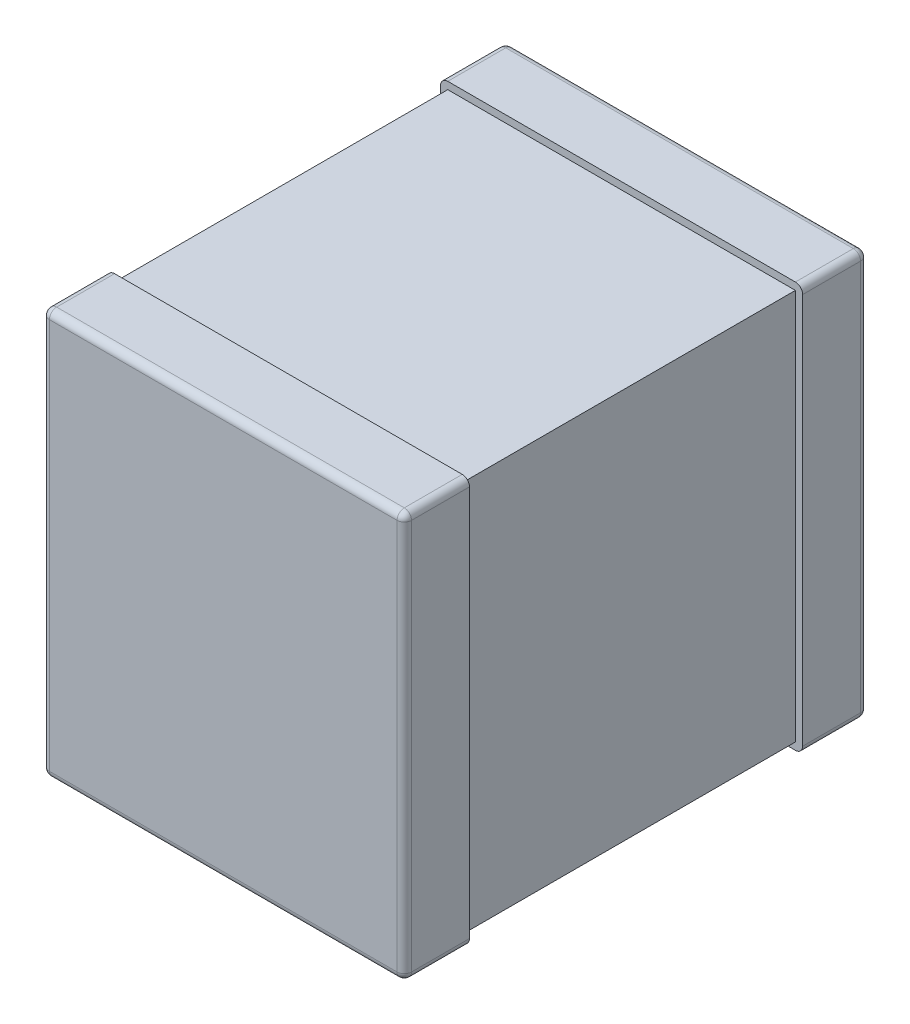
ISO-10303-21;
HEADER;
FILE_DESCRIPTION(('STEP AP214'),'2;1');
FILE_NAME('part.step','',(''),(''),'','','');
FILE_SCHEMA(('AUTOMOTIVE_DESIGN { 1 0 10303 214 1 1 1 1 }'));
ENDSEC;
DATA;
#1=APPLICATION_CONTEXT('core data for automotive mechanical design processes');
#2=APPLICATION_PROTOCOL_DEFINITION('international standard','automotive_design',2000,#1);
#3=PRODUCT_CONTEXT('',#1,'mechanical');
#4=PRODUCT('Part','Part','',(#3));
#5=PRODUCT_RELATED_PRODUCT_CATEGORY('part','',(#4));
#6=PRODUCT_DEFINITION_FORMATION('','',#4);
#7=PRODUCT_DEFINITION_CONTEXT('part definition',#1,'design');
#8=PRODUCT_DEFINITION('design','',#6,#7);
#9=PRODUCT_DEFINITION_SHAPE('','',#8);
#10=(LENGTH_UNIT() NAMED_UNIT(*) SI_UNIT(.MILLI.,.METRE.));
#11=(NAMED_UNIT(*) PLANE_ANGLE_UNIT() SI_UNIT($,.RADIAN.));
#12=(NAMED_UNIT(*) SI_UNIT($,.STERADIAN.) SOLID_ANGLE_UNIT());
#13=UNCERTAINTY_MEASURE_WITH_UNIT(LENGTH_MEASURE(1.E-05),#10,'distance_accuracy_value','');
#14=(GEOMETRIC_REPRESENTATION_CONTEXT(3) GLOBAL_UNCERTAINTY_ASSIGNED_CONTEXT((#13)) GLOBAL_UNIT_ASSIGNED_CONTEXT((#10,
#11,#12)) REPRESENTATION_CONTEXT('',''));
#15=CARTESIAN_POINT('',(0.,0.,0.));
#16=DIRECTION('',(0.,0.,1.));
#17=DIRECTION('',(1.,0.,0.));
#18=AXIS2_PLACEMENT_3D('',#15,#16,#17);
#19=CARTESIAN_POINT('',(-1.25,2.8,-1.6));
#20=DIRECTION('',(0.,0.,1.));
#21=DIRECTION('',(1.,0.,0.));
#22=AXIS2_PLACEMENT_3D('',#19,#20,#21);
#23=PLANE('',#22);
#24=DIRECTION('',(0.,-1.,0.));
#25=VECTOR('',#24,1.);
#26=CARTESIAN_POINT('',(1.2,2.8,-1.6));
#27=LINE('',#26,#25);
#28=CARTESIAN_POINT('',(1.2,0.0500000000000001,-1.6));
#29=VERTEX_POINT('',#28);
#30=CARTESIAN_POINT('',(1.2,2.75,-1.6));
#31=VERTEX_POINT('',#30);
#32=EDGE_CURVE('E306',#29,#31,#27,.F.);
#33=ORIENTED_EDGE('',*,*,#32,.F.);
#34=DIRECTION('',(-1.,0.,0.));
#35=VECTOR('',#34,1.);
#36=CARTESIAN_POINT('',(-1.25,0.0500000000000001,-1.6));
#37=LINE('',#36,#35);
#38=CARTESIAN_POINT('',(-1.2,0.0500000000000001,-1.6));
#39=VERTEX_POINT('',#38);
#40=EDGE_CURVE('E218',#39,#29,#37,.F.);
#41=ORIENTED_EDGE('',*,*,#40,.F.);
#42=DIRECTION('',(0.,-1.,0.));
#43=VECTOR('',#42,1.);
#44=CARTESIAN_POINT('',(-1.2,2.8,-1.6));
#45=LINE('',#44,#43);
#46=CARTESIAN_POINT('',(-1.2,2.75,-1.6));
#47=VERTEX_POINT('',#46);
#48=EDGE_CURVE('E315',#47,#39,#45,.T.);
#49=ORIENTED_EDGE('',*,*,#48,.F.);
#50=DIRECTION('',(1.,0.,0.));
#51=VECTOR('',#50,1.);
#52=CARTESIAN_POINT('',(-1.25,2.75,-1.6));
#53=LINE('',#52,#51);
#54=EDGE_CURVE('E266',#31,#47,#53,.F.);
#55=ORIENTED_EDGE('',*,*,#54,.F.);
#56=EDGE_LOOP('',(#33,#41,#49,#55));
#57=FACE_BOUND('',#56,.T.);
#58=ADVANCED_FACE('F16',(#57),#23,.F.);
#59=CARTESIAN_POINT('',(-1.2,0.05,-1.55));
#60=DIRECTION('',(1.,0.,0.));
#61=DIRECTION('',(0.,0.,-1.));
#62=AXIS2_PLACEMENT_3D('',#59,#60,#61);
#63=SPHERICAL_SURFACE('',#62,0.05);
#64=CARTESIAN_POINT('',(-1.2,0.0500000000000001,-1.55));
#65=DIRECTION('',(0.,-1.,0.));
#66=DIRECTION('',(0.,0.,-1.));
#67=AXIS2_PLACEMENT_3D('',#64,#65,#66);
#68=CIRCLE('',#67,0.0499999999999999);
#69=CARTESIAN_POINT('',(-1.25,0.0500000000000001,-1.55));
#70=VERTEX_POINT('',#69);
#71=EDGE_CURVE('E317',#39,#70,#68,.F.);
#72=ORIENTED_EDGE('',*,*,#71,.F.);
#73=CARTESIAN_POINT('',(-1.2,0.0500000000000001,-1.55));
#74=DIRECTION('',(-1.,0.,0.));
#75=DIRECTION('',(0.,0.,1.));
#76=AXIS2_PLACEMENT_3D('',#73,#74,#75);
#77=CIRCLE('',#76,0.0499999999999999);
#78=CARTESIAN_POINT('',(-1.2,0.,-1.55));
#79=VERTEX_POINT('',#78);
#80=EDGE_CURVE('E224',#79,#39,#77,.F.);
#81=ORIENTED_EDGE('',*,*,#80,.F.);
#82=CARTESIAN_POINT('',(-1.2,0.0500000000000001,-1.55));
#83=DIRECTION('',(0.,0.,1.));
#84=DIRECTION('',(1.,0.,0.));
#85=AXIS2_PLACEMENT_3D('',#82,#83,#84);
#86=CIRCLE('',#85,0.0499999999999999);
#87=EDGE_CURVE('E188',#70,#79,#86,.T.);
#88=ORIENTED_EDGE('',*,*,#87,.F.);
#89=EDGE_LOOP('',(#72,#81,#88));
#90=FACE_BOUND('',#89,.T.);
#91=ADVANCED_FACE('F292',(#90),#63,.T.);
#92=CARTESIAN_POINT('',(-1.2,2.8,-1.55));
#93=DIRECTION('',(0.,-1.,0.));
#94=DIRECTION('',(0.,0.,-1.));
#95=AXIS2_PLACEMENT_3D('',#92,#93,#94);
#96=CYLINDRICAL_SURFACE('',#95,0.0499999999999999);
#97=CARTESIAN_POINT('',(-1.2,2.75,-1.55));
#98=DIRECTION('',(0.,1.,0.));
#99=DIRECTION('',(1.,0.,0.));
#100=AXIS2_PLACEMENT_3D('',#97,#98,#99);
#101=CIRCLE('',#100,0.05);
#102=CARTESIAN_POINT('',(-1.25,2.75,-1.55));
#103=VERTEX_POINT('',#102);
#104=EDGE_CURVE('E277',#47,#103,#101,.T.);
#105=ORIENTED_EDGE('',*,*,#104,.F.);
#106=ORIENTED_EDGE('',*,*,#48,.T.);
#107=ORIENTED_EDGE('',*,*,#71,.T.);
#108=DIRECTION('',(0.,1.,0.));
#109=VECTOR('',#108,1.);
#110=CARTESIAN_POINT('',(-1.25,2.8,-1.55));
#111=LINE('',#110,#109);
#112=EDGE_CURVE('E186',#70,#103,#111,.T.);
#113=ORIENTED_EDGE('',*,*,#112,.T.);
#114=EDGE_LOOP('',(#105,#106,#107,#113));
#115=FACE_BOUND('',#114,.T.);
#116=ADVANCED_FACE('F289',(#115),#96,.T.);
#117=CARTESIAN_POINT('',(-1.2,2.75,-1.55));
#118=DIRECTION('',(1.,0.,0.));
#119=DIRECTION('',(0.,0.,-1.));
#120=AXIS2_PLACEMENT_3D('',#117,#118,#119);
#121=SPHERICAL_SURFACE('',#120,0.05);
#122=CARTESIAN_POINT('',(-1.2,2.75,-1.55));
#123=DIRECTION('',(0.,0.,-1.));
#124=DIRECTION('',(-1.,0.,0.));
#125=AXIS2_PLACEMENT_3D('',#122,#123,#124);
#126=CIRCLE('',#125,0.0499999999999999);
#127=CARTESIAN_POINT('',(-1.2,2.8,-1.55));
#128=VERTEX_POINT('',#127);
#129=EDGE_CURVE('E269',#128,#103,#126,.F.);
#130=ORIENTED_EDGE('',*,*,#129,.F.);
#131=CARTESIAN_POINT('',(-1.2,2.75,-1.55));
#132=DIRECTION('',(1.,0.,0.));
#133=DIRECTION('',(0.,0.,-1.));
#134=AXIS2_PLACEMENT_3D('',#131,#132,#133);
#135=CIRCLE('',#134,0.0499999999999999);
#136=EDGE_CURVE('E275',#47,#128,#135,.T.);
#137=ORIENTED_EDGE('',*,*,#136,.F.);
#138=ORIENTED_EDGE('',*,*,#104,.T.);
#139=EDGE_LOOP('',(#130,#137,#138));
#140=FACE_BOUND('',#139,.T.);
#141=ADVANCED_FACE('F286',(#140),#121,.T.);
#142=CARTESIAN_POINT('',(-1.25,2.75,-1.55));
#143=DIRECTION('',(1.,0.,0.));
#144=DIRECTION('',(0.,0.,-1.));
#145=AXIS2_PLACEMENT_3D('',#142,#143,#144);
#146=CYLINDRICAL_SURFACE('',#145,0.0499999999999999);
#147=CARTESIAN_POINT('',(1.2,2.75,-1.55));
#148=DIRECTION('',(1.,0.,0.));
#149=DIRECTION('',(0.,0.,-1.));
#150=AXIS2_PLACEMENT_3D('',#147,#148,#149);
#151=CIRCLE('',#150,0.0499999999999999);
#152=CARTESIAN_POINT('',(1.2,2.8,-1.55));
#153=VERTEX_POINT('',#152);
#154=EDGE_CURVE('E263',#31,#153,#151,.T.);
#155=ORIENTED_EDGE('',*,*,#154,.F.);
#156=ORIENTED_EDGE('',*,*,#54,.T.);
#157=ORIENTED_EDGE('',*,*,#136,.T.);
#158=DIRECTION('',(1.,0.,0.));
#159=VECTOR('',#158,1.);
#160=CARTESIAN_POINT('',(-1.25,2.8,-1.55));
#161=LINE('',#160,#159);
#162=EDGE_CURVE('E369',#153,#128,#161,.F.);
#163=ORIENTED_EDGE('',*,*,#162,.F.);
#164=EDGE_LOOP('',(#155,#156,#157,#163));
#165=FACE_BOUND('',#164,.T.);
#166=ADVANCED_FACE('F255',(#165),#146,.T.);
#167=CARTESIAN_POINT('',(1.2,2.75,-1.55));
#168=DIRECTION('',(1.,0.,0.));
#169=DIRECTION('',(0.,0.,-1.));
#170=AXIS2_PLACEMENT_3D('',#167,#168,#169);
#171=SPHERICAL_SURFACE('',#170,0.05);
#172=CARTESIAN_POINT('',(1.2,2.75,-1.55));
#173=DIRECTION('',(0.,0.,1.));
#174=DIRECTION('',(1.,0.,0.));
#175=AXIS2_PLACEMENT_3D('',#172,#173,#174);
#176=CIRCLE('',#175,0.0499999999999999);
#177=CARTESIAN_POINT('',(1.25,2.75,-1.55));
#178=VERTEX_POINT('',#177);
#179=EDGE_CURVE('E364',#178,#153,#176,.T.);
#180=ORIENTED_EDGE('',*,*,#179,.F.);
#181=CARTESIAN_POINT('',(1.2,2.75,-1.55));
#182=DIRECTION('',(0.,-1.,0.));
#183=DIRECTION('',(0.,0.,-1.));
#184=AXIS2_PLACEMENT_3D('',#181,#182,#183);
#185=CIRCLE('',#184,0.0499999999999999);
#186=EDGE_CURVE('E265',#31,#178,#185,.T.);
#187=ORIENTED_EDGE('',*,*,#186,.F.);
#188=ORIENTED_EDGE('',*,*,#154,.T.);
#189=EDGE_LOOP('',(#180,#187,#188));
#190=FACE_BOUND('',#189,.T.);
#191=ADVANCED_FACE('F250',(#190),#171,.T.);
#192=CARTESIAN_POINT('',(1.2,2.8,-1.55));
#193=DIRECTION('',(0.,-1.,0.));
#194=DIRECTION('',(0.,0.,-1.));
#195=AXIS2_PLACEMENT_3D('',#192,#193,#194);
#196=CYLINDRICAL_SURFACE('',#195,0.0499999999999999);
#197=CARTESIAN_POINT('',(1.2,0.05,-1.55));
#198=DIRECTION('',(0.,1.,0.));
#199=DIRECTION('',(1.,0.,0.));
#200=AXIS2_PLACEMENT_3D('',#197,#198,#199);
#201=CIRCLE('',#200,0.05);
#202=CARTESIAN_POINT('',(1.25,0.0500000000000001,-1.55));
#203=VERTEX_POINT('',#202);
#204=EDGE_CURVE('E226',#29,#203,#201,.F.);
#205=ORIENTED_EDGE('',*,*,#204,.F.);
#206=ORIENTED_EDGE('',*,*,#32,.T.);
#207=ORIENTED_EDGE('',*,*,#186,.T.);
#208=DIRECTION('',(0.,1.,0.));
#209=VECTOR('',#208,1.);
#210=CARTESIAN_POINT('',(1.25,2.8,-1.55));
#211=LINE('',#210,#209);
#212=EDGE_CURVE('E229',#178,#203,#211,.F.);
#213=ORIENTED_EDGE('',*,*,#212,.T.);
#214=EDGE_LOOP('',(#205,#206,#207,#213));
#215=FACE_BOUND('',#214,.T.);
#216=ADVANCED_FACE('F245',(#215),#196,.T.);
#217=CARTESIAN_POINT('',(1.2,0.05,-1.55));
#218=DIRECTION('',(1.,0.,0.));
#219=DIRECTION('',(0.,0.,-1.));
#220=AXIS2_PLACEMENT_3D('',#217,#218,#219);
#221=SPHERICAL_SURFACE('',#220,0.05);
#222=CARTESIAN_POINT('',(1.2,0.0500000000000001,-1.55));
#223=DIRECTION('',(-1.,0.,0.));
#224=DIRECTION('',(0.,0.,1.));
#225=AXIS2_PLACEMENT_3D('',#222,#223,#224);
#226=CIRCLE('',#225,0.0499999999999999);
#227=CARTESIAN_POINT('',(1.2,0.,-1.55));
#228=VERTEX_POINT('',#227);
#229=EDGE_CURVE('E216',#29,#228,#226,.T.);
#230=ORIENTED_EDGE('',*,*,#229,.F.);
#231=ORIENTED_EDGE('',*,*,#204,.T.);
#232=CARTESIAN_POINT('',(1.2,0.0500000000000001,-1.55));
#233=DIRECTION('',(0.,0.,-1.));
#234=DIRECTION('',(-1.,0.,0.));
#235=AXIS2_PLACEMENT_3D('',#232,#233,#234);
#236=CIRCLE('',#235,0.0499999999999999);
#237=EDGE_CURVE('E232',#228,#203,#236,.F.);
#238=ORIENTED_EDGE('',*,*,#237,.F.);
#239=EDGE_LOOP('',(#230,#231,#238));
#240=FACE_BOUND('',#239,.T.);
#241=ADVANCED_FACE('F240',(#240),#221,.T.);
#242=CARTESIAN_POINT('',(-1.25,0.0500000000000001,-1.55));
#243=DIRECTION('',(-1.,0.,0.));
#244=DIRECTION('',(0.,0.,1.));
#245=AXIS2_PLACEMENT_3D('',#242,#243,#244);
#246=CYLINDRICAL_SURFACE('',#245,0.0499999999999999);
#247=ORIENTED_EDGE('',*,*,#229,.T.);
#248=DIRECTION('',(1.,0.,0.));
#249=VECTOR('',#248,1.);
#250=CARTESIAN_POINT('',(-1.25,0.,-1.55));
#251=LINE('',#250,#249);
#252=EDGE_CURVE('E201',#228,#79,#251,.F.);
#253=ORIENTED_EDGE('',*,*,#252,.T.);
#254=ORIENTED_EDGE('',*,*,#80,.T.);
#255=ORIENTED_EDGE('',*,*,#40,.T.);
#256=EDGE_LOOP('',(#247,#253,#254,#255));
#257=FACE_BOUND('',#256,.T.);
#258=ADVANCED_FACE('F244',(#257),#246,.T.);
#259=CARTESIAN_POINT('',(-1.2,0.0500000000000001,-1.6));
#260=DIRECTION('',(0.,0.,1.));
#261=DIRECTION('',(1.,0.,0.));
#262=AXIS2_PLACEMENT_3D('',#259,#260,#261);
#263=CYLINDRICAL_SURFACE('',#262,0.0499999999999999);
#264=ORIENTED_EDGE('',*,*,#87,.T.);
#265=DIRECTION('',(0.,0.,1.));
#266=VECTOR('',#265,1.);
#267=CARTESIAN_POINT('',(-1.2,0.,1.6));
#268=LINE('',#267,#266);
#269=CARTESIAN_POINT('',(-1.2,0.,-1.15));
#270=VERTEX_POINT('',#269);
#271=EDGE_CURVE('E199',#79,#270,#268,.T.);
#272=ORIENTED_EDGE('',*,*,#271,.T.);
#273=CARTESIAN_POINT('',(-1.2,0.0500000000000001,-1.15));
#274=DIRECTION('',(0.,0.,1.));
#275=DIRECTION('',(1.,0.,0.));
#276=AXIS2_PLACEMENT_3D('',#273,#274,#275);
#277=CIRCLE('',#276,0.0499999999999999);
#278=CARTESIAN_POINT('',(-1.25,0.0500000000000001,-1.15));
#279=VERTEX_POINT('',#278);
#280=EDGE_CURVE('E19',#270,#279,#277,.F.);
#281=ORIENTED_EDGE('',*,*,#280,.T.);
#282=DIRECTION('',(0.,0.,-1.));
#283=VECTOR('',#282,1.);
#284=CARTESIAN_POINT('',(-1.25,0.0500000000000001,-1.6));
#285=LINE('',#284,#283);
#286=EDGE_CURVE('E181',#279,#70,#285,.T.);
#287=ORIENTED_EDGE('',*,*,#286,.T.);
#288=EDGE_LOOP('',(#264,#272,#281,#287));
#289=FACE_BOUND('',#288,.T.);
#290=ADVANCED_FACE('F197',(#289),#263,.T.);
#291=CARTESIAN_POINT('',(-1.25,2.8,-1.6));
#292=DIRECTION('',(1.,0.,0.));
#293=DIRECTION('',(0.,0.,-1.));
#294=AXIS2_PLACEMENT_3D('',#291,#292,#293);
#295=PLANE('',#294);
#296=ORIENTED_EDGE('',*,*,#286,.F.);
#297=DIRECTION('',(0.,1.,0.));
#298=VECTOR('',#297,1.);
#299=CARTESIAN_POINT('',(-1.25,3.11952114007836,-1.15));
#300=LINE('',#299,#298);
#301=CARTESIAN_POINT('',(-1.25,2.75,-1.15));
#302=VERTEX_POINT('',#301);
#303=EDGE_CURVE('E184',#279,#302,#300,.T.);
#304=ORIENTED_EDGE('',*,*,#303,.T.);
#305=DIRECTION('',(0.,0.,-1.));
#306=VECTOR('',#305,1.);
#307=CARTESIAN_POINT('',(-1.25,2.75,1.6));
#308=LINE('',#307,#306);
#309=EDGE_CURVE('E272',#103,#302,#308,.F.);
#310=ORIENTED_EDGE('',*,*,#309,.F.);
#311=ORIENTED_EDGE('',*,*,#112,.F.);
#312=EDGE_LOOP('',(#296,#304,#310,#311));
#313=FACE_BOUND('',#312,.T.);
#314=ADVANCED_FACE('F182',(#313),#295,.F.);
#315=CARTESIAN_POINT('',(-1.2,2.75,1.6));
#316=DIRECTION('',(0.,0.,-1.));
#317=DIRECTION('',(-1.,0.,0.));
#318=AXIS2_PLACEMENT_3D('',#315,#316,#317);
#319=CYLINDRICAL_SURFACE('',#318,0.0499999999999999);
#320=ORIENTED_EDGE('',*,*,#129,.T.);
#321=ORIENTED_EDGE('',*,*,#309,.T.);
#322=CARTESIAN_POINT('',(-1.2,2.75,-1.15));
#323=DIRECTION('',(0.,0.,-1.));
#324=DIRECTION('',(-1.,0.,0.));
#325=AXIS2_PLACEMENT_3D('',#322,#323,#324);
#326=CIRCLE('',#325,0.0499999999999999);
#327=CARTESIAN_POINT('',(-1.2,2.8,-1.15));
#328=VERTEX_POINT('',#327);
#329=EDGE_CURVE('E195',#302,#328,#326,.T.);
#330=ORIENTED_EDGE('',*,*,#329,.T.);
#331=DIRECTION('',(0.,0.,1.));
#332=VECTOR('',#331,1.);
#333=CARTESIAN_POINT('',(-1.2,2.8,1.6));
#334=LINE('',#333,#332);
#335=EDGE_CURVE('E367',#128,#328,#334,.T.);
#336=ORIENTED_EDGE('',*,*,#335,.F.);
#337=EDGE_LOOP('',(#320,#321,#330,#336));
#338=FACE_BOUND('',#337,.T.);
#339=ADVANCED_FACE('F402',(#338),#319,.T.);
#340=CARTESIAN_POINT('',(-1.25,2.8,1.6));
#341=DIRECTION('',(0.,1.,0.));
#342=DIRECTION('',(0.,0.,1.));
#343=AXIS2_PLACEMENT_3D('',#340,#341,#342);
#344=PLANE('',#343);
#345=ORIENTED_EDGE('',*,*,#162,.T.);
#346=ORIENTED_EDGE('',*,*,#335,.T.);
#347=DIRECTION('',(-1.,0.,0.));
#348=VECTOR('',#347,1.);
#349=CARTESIAN_POINT('',(-1.25,2.8,-1.15));
#350=LINE('',#349,#348);
#351=CARTESIAN_POINT('',(1.2,2.8,-1.15));
#352=VERTEX_POINT('',#351);
#353=EDGE_CURVE('E339',#328,#352,#350,.F.);
#354=ORIENTED_EDGE('',*,*,#353,.T.);
#355=DIRECTION('',(0.,0.,1.));
#356=VECTOR('',#355,1.);
#357=CARTESIAN_POINT('',(1.2,2.8,1.6));
#358=LINE('',#357,#356);
#359=EDGE_CURVE('E360',#153,#352,#358,.T.);
#360=ORIENTED_EDGE('',*,*,#359,.F.);
#361=EDGE_LOOP('',(#345,#346,#354,#360));
#362=FACE_BOUND('',#361,.T.);
#363=ADVANCED_FACE('F396',(#362),#344,.T.);
#364=CARTESIAN_POINT('',(1.2,2.75,1.6));
#365=DIRECTION('',(0.,0.,1.));
#366=DIRECTION('',(1.,0.,0.));
#367=AXIS2_PLACEMENT_3D('',#364,#365,#366);
#368=CYLINDRICAL_SURFACE('',#367,0.0499999999999999);
#369=ORIENTED_EDGE('',*,*,#179,.T.);
#370=ORIENTED_EDGE('',*,*,#359,.T.);
#371=CARTESIAN_POINT('',(1.2,2.75,-1.15));
#372=DIRECTION('',(0.,0.,1.));
#373=DIRECTION('',(1.,0.,0.));
#374=AXIS2_PLACEMENT_3D('',#371,#372,#373);
#375=CIRCLE('',#374,0.0499999999999999);
#376=CARTESIAN_POINT('',(1.25,2.75,-1.15));
#377=VERTEX_POINT('',#376);
#378=EDGE_CURVE('E337',#352,#377,#375,.F.);
#379=ORIENTED_EDGE('',*,*,#378,.T.);
#380=DIRECTION('',(0.,0.,1.));
#381=VECTOR('',#380,1.);
#382=CARTESIAN_POINT('',(1.25,2.75,-1.6));
#383=LINE('',#382,#381);
#384=EDGE_CURVE('E233',#377,#178,#383,.F.);
#385=ORIENTED_EDGE('',*,*,#384,.T.);
#386=EDGE_LOOP('',(#369,#370,#379,#385));
#387=FACE_BOUND('',#386,.T.);
#388=ADVANCED_FACE('F393',(#387),#368,.T.);
#389=CARTESIAN_POINT('',(1.25,2.8,-1.6));
#390=DIRECTION('',(-1.,0.,0.));
#391=DIRECTION('',(0.,0.,1.));
#392=AXIS2_PLACEMENT_3D('',#389,#390,#391);
#393=PLANE('',#392);
#394=DIRECTION('',(0.,0.,-1.));
#395=VECTOR('',#394,1.);
#396=CARTESIAN_POINT('',(1.25,0.0500000000000001,-1.6));
#397=LINE('',#396,#395);
#398=CARTESIAN_POINT('',(1.25,0.0500000000000001,-1.15));
#399=VERTEX_POINT('',#398);
#400=EDGE_CURVE('E352',#203,#399,#397,.F.);
#401=ORIENTED_EDGE('',*,*,#400,.F.);
#402=ORIENTED_EDGE('',*,*,#212,.F.);
#403=ORIENTED_EDGE('',*,*,#384,.F.);
#404=DIRECTION('',(0.,1.,0.));
#405=VECTOR('',#404,1.);
#406=CARTESIAN_POINT('',(1.25,3.11952114007836,-1.15));
#407=LINE('',#406,#405);
#408=EDGE_CURVE('E336',#377,#399,#407,.F.);
#409=ORIENTED_EDGE('',*,*,#408,.T.);
#410=EDGE_LOOP('',(#401,#402,#403,#409));
#411=FACE_BOUND('',#410,.T.);
#412=ADVANCED_FACE('F388',(#411),#393,.F.);
#413=CARTESIAN_POINT('',(1.2,0.0500000000000001,-1.6));
#414=DIRECTION('',(0.,0.,-1.));
#415=DIRECTION('',(-1.,0.,0.));
#416=AXIS2_PLACEMENT_3D('',#413,#414,#415);
#417=CYLINDRICAL_SURFACE('',#416,0.0499999999999999);
#418=ORIENTED_EDGE('',*,*,#237,.T.);
#419=ORIENTED_EDGE('',*,*,#400,.T.);
#420=CARTESIAN_POINT('',(1.2,0.0500000000000001,-1.15));
#421=DIRECTION('',(0.,0.,-1.));
#422=DIRECTION('',(-1.,0.,0.));
#423=AXIS2_PLACEMENT_3D('',#420,#421,#422);
#424=CIRCLE('',#423,0.0499999999999999);
#425=CARTESIAN_POINT('',(1.2,0.,-1.15));
#426=VERTEX_POINT('',#425);
#427=EDGE_CURVE('E332',#399,#426,#424,.T.);
#428=ORIENTED_EDGE('',*,*,#427,.T.);
#429=DIRECTION('',(0.,0.,1.));
#430=VECTOR('',#429,1.);
#431=CARTESIAN_POINT('',(1.2,0.,1.6));
#432=LINE('',#431,#430);
#433=EDGE_CURVE('E203',#426,#228,#432,.F.);
#434=ORIENTED_EDGE('',*,*,#433,.T.);
#435=EDGE_LOOP('',(#418,#419,#428,#434));
#436=FACE_BOUND('',#435,.T.);
#437=ADVANCED_FACE('F379',(#436),#417,.T.);
#438=CARTESIAN_POINT('',(-1.25,0.,1.6));
#439=DIRECTION('',(0.,1.,0.));
#440=DIRECTION('',(0.,0.,1.));
#441=AXIS2_PLACEMENT_3D('',#438,#439,#440);
#442=PLANE('',#441);
#443=ORIENTED_EDGE('',*,*,#433,.F.);
#444=DIRECTION('',(-1.,0.,0.));
#445=VECTOR('',#444,1.);
#446=CARTESIAN_POINT('',(-1.25,0.,-1.15));
#447=LINE('',#446,#445);
#448=EDGE_CURVE('E335',#426,#270,#447,.T.);
#449=ORIENTED_EDGE('',*,*,#448,.T.);
#450=ORIENTED_EDGE('',*,*,#271,.F.);
#451=ORIENTED_EDGE('',*,*,#252,.F.);
#452=EDGE_LOOP('',(#443,#449,#450,#451));
#453=FACE_BOUND('',#452,.T.);
#454=ADVANCED_FACE('F619',(#453),#442,.F.);
#455=CARTESIAN_POINT('',(-1.25,3.11952114007836,-1.15));
#456=DIRECTION('',(0.,0.,-1.));
#457=DIRECTION('',(-1.,0.,0.));
#458=AXIS2_PLACEMENT_3D('',#455,#456,#457);
#459=PLANE('',#458);
#460=DIRECTION('',(0.,1.,0.));
#461=VECTOR('',#460,1.);
#462=CARTESIAN_POINT('',(-1.2,0.,-1.15));
#463=LINE('',#462,#461);
#464=CARTESIAN_POINT('',(-1.2,0.0499999999999998,-1.15));
#465=VERTEX_POINT('',#464);
#466=CARTESIAN_POINT('',(-1.2,2.75,-1.15));
#467=VERTEX_POINT('',#466);
#468=EDGE_CURVE('E601',#465,#467,#463,.T.);
#469=ORIENTED_EDGE('',*,*,#468,.T.);
#470=DIRECTION('',(1.,0.,0.));
#471=VECTOR('',#470,1.);
#472=CARTESIAN_POINT('',(-1.25,2.75,-1.15));
#473=LINE('',#472,#471);
#474=CARTESIAN_POINT('',(1.2,2.75,-1.15));
#475=VERTEX_POINT('',#474);
#476=EDGE_CURVE('E617',#467,#475,#473,.T.);
#477=ORIENTED_EDGE('',*,*,#476,.T.);
#478=DIRECTION('',(0.,1.,0.));
#479=VECTOR('',#478,1.);
#480=CARTESIAN_POINT('',(1.2,0.,-1.15));
#481=LINE('',#480,#479);
#482=CARTESIAN_POINT('',(1.2,0.0499999999999997,-1.15));
#483=VERTEX_POINT('',#482);
#484=EDGE_CURVE('E612',#475,#483,#481,.F.);
#485=ORIENTED_EDGE('',*,*,#484,.T.);
#486=DIRECTION('',(1.,0.,0.));
#487=VECTOR('',#486,1.);
#488=CARTESIAN_POINT('',(-1.25,0.0499999999999997,-1.15));
#489=LINE('',#488,#487);
#490=EDGE_CURVE('E607',#483,#465,#489,.F.);
#491=ORIENTED_EDGE('',*,*,#490,.T.);
#492=EDGE_LOOP('',(#469,#477,#485,#491));
#493=FACE_BOUND('',#492,.T.);
#494=ORIENTED_EDGE('',*,*,#427,.F.);
#495=ORIENTED_EDGE('',*,*,#408,.F.);
#496=ORIENTED_EDGE('',*,*,#378,.F.);
#497=ORIENTED_EDGE('',*,*,#353,.F.);
#498=ORIENTED_EDGE('',*,*,#329,.F.);
#499=ORIENTED_EDGE('',*,*,#303,.F.);
#500=ORIENTED_EDGE('',*,*,#280,.F.);
#501=ORIENTED_EDGE('',*,*,#448,.F.);
#502=EDGE_LOOP('',(#494,#495,#496,#497,#498,#499,#500,#501));
#503=FACE_BOUND('',#502,.T.);
#504=ADVANCED_FACE('F192',(#493,#503),#459,.F.);
#505=CARTESIAN_POINT('',(-1.25,2.75,1.15));
#506=DIRECTION('',(0.,-1.,0.));
#507=DIRECTION('',(0.,0.,-1.));
#508=AXIS2_PLACEMENT_3D('',#505,#506,#507);
#509=PLANE('',#508);
#510=DIRECTION('',(0.,0.,-1.));
#511=VECTOR('',#510,1.);
#512=CARTESIAN_POINT('',(-1.2,2.75,-1.15));
#513=LINE('',#512,#511);
#514=CARTESIAN_POINT('',(-1.2,2.75,1.15));
#515=VERTEX_POINT('',#514);
#516=EDGE_CURVE('E485',#467,#515,#513,.F.);
#517=ORIENTED_EDGE('',*,*,#516,.T.);
#518=DIRECTION('',(1.,0.,0.));
#519=VECTOR('',#518,1.);
#520=CARTESIAN_POINT('',(-1.25,2.75,1.15));
#521=LINE('',#520,#519);
#522=CARTESIAN_POINT('',(1.2,2.75,1.15));
#523=VERTEX_POINT('',#522);
#524=EDGE_CURVE('E482',#515,#523,#521,.T.);
#525=ORIENTED_EDGE('',*,*,#524,.T.);
#526=DIRECTION('',(0.,0.,1.));
#527=VECTOR('',#526,1.);
#528=CARTESIAN_POINT('',(1.2,2.75,1.15));
#529=LINE('',#528,#527);
#530=EDGE_CURVE('E614',#523,#475,#529,.F.);
#531=ORIENTED_EDGE('',*,*,#530,.T.);
#532=ORIENTED_EDGE('',*,*,#476,.F.);
#533=EDGE_LOOP('',(#517,#525,#531,#532));
#534=FACE_BOUND('',#533,.T.);
#535=ADVANCED_FACE('F719',(#534),#509,.F.);
#536=CARTESIAN_POINT('',(1.2,0.,1.15));
#537=DIRECTION('',(-1.,0.,0.));
#538=DIRECTION('',(0.,0.,1.));
#539=AXIS2_PLACEMENT_3D('',#536,#537,#538);
#540=PLANE('',#539);
#541=ORIENTED_EDGE('',*,*,#530,.F.);
#542=DIRECTION('',(0.,1.,0.));
#543=VECTOR('',#542,1.);
#544=CARTESIAN_POINT('',(1.2,3.11952114007836,1.15));
#545=LINE('',#544,#543);
#546=CARTESIAN_POINT('',(1.2,0.0499999999999998,1.15));
#547=VERTEX_POINT('',#546);
#548=EDGE_CURVE('E479',#523,#547,#545,.F.);
#549=ORIENTED_EDGE('',*,*,#548,.T.);
#550=DIRECTION('',(0.,0.,1.));
#551=VECTOR('',#550,1.);
#552=CARTESIAN_POINT('',(1.2,0.05,1.15));
#553=LINE('',#552,#551);
#554=EDGE_CURVE('E609',#547,#483,#553,.F.);
#555=ORIENTED_EDGE('',*,*,#554,.T.);
#556=ORIENTED_EDGE('',*,*,#484,.F.);
#557=EDGE_LOOP('',(#541,#549,#555,#556));
#558=FACE_BOUND('',#557,.T.);
#559=ADVANCED_FACE('F730',(#558),#540,.F.);
#560=CARTESIAN_POINT('',(-1.25,0.05,1.15));
#561=DIRECTION('',(0.,1.,0.));
#562=DIRECTION('',(0.,0.,1.));
#563=AXIS2_PLACEMENT_3D('',#560,#561,#562);
#564=PLANE('',#563);
#565=DIRECTION('',(0.,0.,-1.));
#566=VECTOR('',#565,1.);
#567=CARTESIAN_POINT('',(-1.2,0.05,-1.15));
#568=LINE('',#567,#566);
#569=CARTESIAN_POINT('',(-1.2,0.0499999999999999,1.15));
#570=VERTEX_POINT('',#569);
#571=EDGE_CURVE('E604',#570,#465,#568,.T.);
#572=ORIENTED_EDGE('',*,*,#571,.T.);
#573=ORIENTED_EDGE('',*,*,#490,.F.);
#574=ORIENTED_EDGE('',*,*,#554,.F.);
#575=DIRECTION('',(1.,0.,0.));
#576=VECTOR('',#575,1.);
#577=CARTESIAN_POINT('',(-1.25,0.0499999999999997,1.15));
#578=LINE('',#577,#576);
#579=EDGE_CURVE('E476',#547,#570,#578,.F.);
#580=ORIENTED_EDGE('',*,*,#579,.T.);
#581=EDGE_LOOP('',(#572,#573,#574,#580));
#582=FACE_BOUND('',#581,.T.);
#583=ADVANCED_FACE('F741',(#582),#564,.F.);
#584=CARTESIAN_POINT('',(-1.2,0.,-1.15));
#585=DIRECTION('',(1.,0.,0.));
#586=DIRECTION('',(0.,0.,-1.));
#587=AXIS2_PLACEMENT_3D('',#584,#585,#586);
#588=PLANE('',#587);
#589=ORIENTED_EDGE('',*,*,#516,.F.);
#590=ORIENTED_EDGE('',*,*,#468,.F.);
#591=ORIENTED_EDGE('',*,*,#571,.F.);
#592=DIRECTION('',(0.,1.,0.));
#593=VECTOR('',#592,1.);
#594=CARTESIAN_POINT('',(-1.2,3.11952114007836,1.15));
#595=LINE('',#594,#593);
#596=EDGE_CURVE('E331',#570,#515,#595,.T.);
#597=ORIENTED_EDGE('',*,*,#596,.T.);
#598=EDGE_LOOP('',(#589,#590,#591,#597));
#599=FACE_BOUND('',#598,.T.);
#600=ADVANCED_FACE('F751',(#599),#588,.F.);
#601=CARTESIAN_POINT('',(1.2,0.0500000000000001,-1.6));
#602=DIRECTION('',(0.,0.,-1.));
#603=DIRECTION('',(-1.,0.,0.));
#604=AXIS2_PLACEMENT_3D('',#601,#602,#603);
#605=CYLINDRICAL_SURFACE('',#604,0.0499999999999999);
#606=CARTESIAN_POINT('',(1.2,0.0499999999999999,1.55));
#607=DIRECTION('',(0.,0.,-1.));
#608=DIRECTION('',(1.,0.,0.));
#609=AXIS2_PLACEMENT_3D('',#606,#607,#608);
#610=CIRCLE('',#609,0.05);
#611=CARTESIAN_POINT('',(1.2,0.,1.55));
#612=VERTEX_POINT('',#611);
#613=CARTESIAN_POINT('',(1.25,0.0500000000000001,1.55));
#614=VERTEX_POINT('',#613);
#615=EDGE_CURVE('E570',#612,#614,#610,.F.);
#616=ORIENTED_EDGE('',*,*,#615,.F.);
#617=DIRECTION('',(0.,0.,1.));
#618=VECTOR('',#617,1.);
#619=CARTESIAN_POINT('',(1.2,0.,1.6));
#620=LINE('',#619,#618);
#621=CARTESIAN_POINT('',(1.2,0.,1.15));
#622=VERTEX_POINT('',#621);
#623=EDGE_CURVE('E560',#612,#622,#620,.F.);
#624=ORIENTED_EDGE('',*,*,#623,.T.);
#625=CARTESIAN_POINT('',(1.2,0.0500000000000001,1.15));
#626=DIRECTION('',(0.,0.,-1.));
#627=DIRECTION('',(-1.,0.,0.));
#628=AXIS2_PLACEMENT_3D('',#625,#626,#627);
#629=CIRCLE('',#628,0.0499999999999999);
#630=CARTESIAN_POINT('',(1.25,0.0500000000000001,1.15));
#631=VERTEX_POINT('',#630);
#632=EDGE_CURVE('E323',#622,#631,#629,.F.);
#633=ORIENTED_EDGE('',*,*,#632,.T.);
#634=DIRECTION('',(0.,0.,1.));
#635=VECTOR('',#634,1.);
#636=CARTESIAN_POINT('',(1.25,0.0500000000000001,-1.6));
#637=LINE('',#636,#635);
#638=EDGE_CURVE('E574',#631,#614,#637,.T.);
#639=ORIENTED_EDGE('',*,*,#638,.T.);
#640=EDGE_LOOP('',(#616,#624,#633,#639));
#641=FACE_BOUND('',#640,.T.);
#642=ADVANCED_FACE('F761',(#641),#605,.T.);
#643=CARTESIAN_POINT('',(-1.2,0.0500000000000001,-1.6));
#644=DIRECTION('',(0.,0.,1.));
#645=DIRECTION('',(1.,0.,0.));
#646=AXIS2_PLACEMENT_3D('',#643,#644,#645);
#647=CYLINDRICAL_SURFACE('',#646,0.0499999999999999);
#648=CARTESIAN_POINT('',(-1.2,0.0499999999999999,1.55));
#649=DIRECTION('',(0.,0.,-1.));
#650=DIRECTION('',(1.,0.,0.));
#651=AXIS2_PLACEMENT_3D('',#648,#649,#650);
#652=CIRCLE('',#651,0.05);
#653=CARTESIAN_POINT('',(-1.25,0.0500000000000001,1.55));
#654=VERTEX_POINT('',#653);
#655=CARTESIAN_POINT('',(-1.2,0.,1.55));
#656=VERTEX_POINT('',#655);
#657=EDGE_CURVE('E504',#654,#656,#652,.F.);
#658=ORIENTED_EDGE('',*,*,#657,.F.);
#659=DIRECTION('',(0.,0.,-1.));
#660=VECTOR('',#659,1.);
#661=CARTESIAN_POINT('',(-1.25,0.0500000000000001,-1.6));
#662=LINE('',#661,#660);
#663=CARTESIAN_POINT('',(-1.25,0.0500000000000001,1.15));
#664=VERTEX_POINT('',#663);
#665=EDGE_CURVE('E526',#654,#664,#662,.T.);
#666=ORIENTED_EDGE('',*,*,#665,.T.);
#667=CARTESIAN_POINT('',(-1.2,0.0500000000000001,1.15));
#668=DIRECTION('',(0.,0.,1.));
#669=DIRECTION('',(1.,0.,0.));
#670=AXIS2_PLACEMENT_3D('',#667,#668,#669);
#671=CIRCLE('',#670,0.0499999999999999);
#672=CARTESIAN_POINT('',(-1.2,0.,1.15));
#673=VERTEX_POINT('',#672);
#674=EDGE_CURVE('E325',#664,#673,#671,.T.);
#675=ORIENTED_EDGE('',*,*,#674,.T.);
#676=DIRECTION('',(0.,0.,1.));
#677=VECTOR('',#676,1.);
#678=CARTESIAN_POINT('',(-1.2,0.,1.6));
#679=LINE('',#678,#677);
#680=EDGE_CURVE('E563',#673,#656,#679,.T.);
#681=ORIENTED_EDGE('',*,*,#680,.T.);
#682=EDGE_LOOP('',(#658,#666,#675,#681));
#683=FACE_BOUND('',#682,.T.);
#684=ADVANCED_FACE('F771',(#683),#647,.T.);
#685=CARTESIAN_POINT('',(1.2,2.75,1.6));
#686=DIRECTION('',(0.,0.,1.));
#687=DIRECTION('',(1.,0.,0.));
#688=AXIS2_PLACEMENT_3D('',#685,#686,#687);
#689=CYLINDRICAL_SURFACE('',#688,0.0499999999999999);
#690=CARTESIAN_POINT('',(1.2,2.75,1.55));
#691=DIRECTION('',(0.,-1.53321187377335E-11,1.));
#692=DIRECTION('',(1.,0.,0.));
#693=AXIS2_PLACEMENT_3D('',#690,#691,#692);
#694=CIRCLE('',#693,0.05);
#695=CARTESIAN_POINT('',(1.25,2.75,1.55));
#696=VERTEX_POINT('',#695);
#697=CARTESIAN_POINT('',(1.2,2.8,1.55000000000038));
#698=VERTEX_POINT('',#697);
#699=EDGE_CURVE('E489',#696,#698,#694,.T.);
#700=ORIENTED_EDGE('',*,*,#699,.F.);
#701=DIRECTION('',(0.,0.,1.));
#702=VECTOR('',#701,1.);
#703=CARTESIAN_POINT('',(1.25,2.75,-1.6));
#704=LINE('',#703,#702);
#705=CARTESIAN_POINT('',(1.25,2.75,1.15));
#706=VERTEX_POINT('',#705);
#707=EDGE_CURVE('E322',#696,#706,#704,.F.);
#708=ORIENTED_EDGE('',*,*,#707,.T.);
#709=CARTESIAN_POINT('',(1.2,2.75,1.15));
#710=DIRECTION('',(0.,0.,1.));
#711=DIRECTION('',(1.,0.,0.));
#712=AXIS2_PLACEMENT_3D('',#709,#710,#711);
#713=CIRCLE('',#712,0.0499999999999999);
#714=CARTESIAN_POINT('',(1.2,2.8,1.15));
#715=VERTEX_POINT('',#714);
#716=EDGE_CURVE('E328',#706,#715,#713,.T.);
#717=ORIENTED_EDGE('',*,*,#716,.T.);
#718=DIRECTION('',(0.,0.,1.));
#719=VECTOR('',#718,1.);
#720=CARTESIAN_POINT('',(1.2,2.8,1.6));
#721=LINE('',#720,#719);
#722=EDGE_CURVE('E486',#698,#715,#721,.F.);
#723=ORIENTED_EDGE('',*,*,#722,.F.);
#724=EDGE_LOOP('',(#700,#708,#717,#723));
#725=FACE_BOUND('',#724,.T.);
#726=ADVANCED_FACE('F781',(#725),#689,.T.);
#727=CARTESIAN_POINT('',(-1.25,3.11952114007836,1.15));
#728=DIRECTION('',(0.,0.,1.));
#729=DIRECTION('',(1.,0.,0.));
#730=AXIS2_PLACEMENT_3D('',#727,#728,#729);
#731=PLANE('',#730);
#732=ORIENTED_EDGE('',*,*,#632,.F.);
#733=DIRECTION('',(1.,0.,0.));
#734=VECTOR('',#733,1.);
#735=CARTESIAN_POINT('',(-1.25,0.,1.15));
#736=LINE('',#735,#734);
#737=EDGE_CURVE('E537',#622,#673,#736,.F.);
#738=ORIENTED_EDGE('',*,*,#737,.T.);
#739=ORIENTED_EDGE('',*,*,#674,.F.);
#740=DIRECTION('',(0.,1.,0.));
#741=VECTOR('',#740,1.);
#742=CARTESIAN_POINT('',(-1.25,2.8,1.15));
#743=LINE('',#742,#741);
#744=CARTESIAN_POINT('',(-1.25,2.75,1.15));
#745=VERTEX_POINT('',#744);
#746=EDGE_CURVE('E529',#664,#745,#743,.T.);
#747=ORIENTED_EDGE('',*,*,#746,.T.);
#748=CARTESIAN_POINT('',(-1.2,2.75,1.15));
#749=DIRECTION('',(0.,0.,-1.));
#750=DIRECTION('',(-1.,0.,0.));
#751=AXIS2_PLACEMENT_3D('',#748,#749,#750);
#752=CIRCLE('',#751,0.0499999999999999);
#753=CARTESIAN_POINT('',(-1.2,2.8,1.15));
#754=VERTEX_POINT('',#753);
#755=EDGE_CURVE('E320',#754,#745,#752,.F.);
#756=ORIENTED_EDGE('',*,*,#755,.F.);
#757=DIRECTION('',(1.,0.,0.));
#758=VECTOR('',#757,1.);
#759=CARTESIAN_POINT('',(-1.25,2.8,1.15));
#760=LINE('',#759,#758);
#761=EDGE_CURVE('E488',#715,#754,#760,.F.);
#762=ORIENTED_EDGE('',*,*,#761,.F.);
#763=ORIENTED_EDGE('',*,*,#716,.F.);
#764=DIRECTION('',(0.,1.,0.));
#765=VECTOR('',#764,1.);
#766=CARTESIAN_POINT('',(1.25,2.8,1.15));
#767=LINE('',#766,#765);
#768=EDGE_CURVE('E519',#706,#631,#767,.F.);
#769=ORIENTED_EDGE('',*,*,#768,.T.);
#770=EDGE_LOOP('',(#732,#738,#739,#747,#756,#762,#763,#769));
#771=FACE_BOUND('',#770,.T.);
#772=ORIENTED_EDGE('',*,*,#579,.F.);
#773=ORIENTED_EDGE('',*,*,#548,.F.);
#774=ORIENTED_EDGE('',*,*,#524,.F.);
#775=ORIENTED_EDGE('',*,*,#596,.F.);
#776=EDGE_LOOP('',(#772,#773,#774,#775));
#777=FACE_BOUND('',#776,.T.);
#778=ADVANCED_FACE('F791',(#771,#777),#731,.F.);
#779=CARTESIAN_POINT('',(-1.2,2.75,1.6));
#780=DIRECTION('',(0.,0.,-1.));
#781=DIRECTION('',(-1.,0.,0.));
#782=AXIS2_PLACEMENT_3D('',#779,#780,#781);
#783=CYLINDRICAL_SURFACE('',#782,0.0499999999999999);
#784=CARTESIAN_POINT('',(-1.2,2.75,1.55));
#785=DIRECTION('',(0.,0.,1.));
#786=DIRECTION('',(1.,0.,0.));
#787=AXIS2_PLACEMENT_3D('',#784,#785,#786);
#788=CIRCLE('',#787,0.05);
#789=CARTESIAN_POINT('',(-1.2,2.8,1.55));
#790=VERTEX_POINT('',#789);
#791=CARTESIAN_POINT('',(-1.25,2.75,1.55));
#792=VERTEX_POINT('',#791);
#793=EDGE_CURVE('E495',#790,#792,#788,.T.);
#794=ORIENTED_EDGE('',*,*,#793,.F.);
#795=DIRECTION('',(0.,0.,1.));
#796=VECTOR('',#795,1.);
#797=CARTESIAN_POINT('',(-1.2,2.8,1.6));
#798=LINE('',#797,#796);
#799=EDGE_CURVE('E493',#754,#790,#798,.T.);
#800=ORIENTED_EDGE('',*,*,#799,.F.);
#801=ORIENTED_EDGE('',*,*,#755,.T.);
#802=DIRECTION('',(0.,0.,-1.));
#803=VECTOR('',#802,1.);
#804=CARTESIAN_POINT('',(-1.25,2.75,-1.6));
#805=LINE('',#804,#803);
#806=EDGE_CURVE('E530',#745,#792,#805,.F.);
#807=ORIENTED_EDGE('',*,*,#806,.T.);
#808=EDGE_LOOP('',(#794,#800,#801,#807));
#809=FACE_BOUND('',#808,.T.);
#810=ADVANCED_FACE('F801',(#809),#783,.T.);
#811=CARTESIAN_POINT('',(1.25,2.8,-1.6));
#812=DIRECTION('',(-1.,0.,0.));
#813=DIRECTION('',(0.,0.,1.));
#814=AXIS2_PLACEMENT_3D('',#811,#812,#813);
#815=PLANE('',#814);
#816=ORIENTED_EDGE('',*,*,#638,.F.);
#817=ORIENTED_EDGE('',*,*,#768,.F.);
#818=ORIENTED_EDGE('',*,*,#707,.F.);
#819=DIRECTION('',(0.,-1.,0.));
#820=VECTOR('',#819,1.);
#821=CARTESIAN_POINT('',(1.25,2.8,1.55));
#822=LINE('',#821,#820);
#823=EDGE_CURVE('E510',#614,#696,#822,.F.);
#824=ORIENTED_EDGE('',*,*,#823,.F.);
#825=EDGE_LOOP('',(#816,#817,#818,#824));
#826=FACE_BOUND('',#825,.T.);
#827=ADVANCED_FACE('F469',(#826),#815,.F.);
#828=CARTESIAN_POINT('',(1.2,0.05,1.55));
#829=DIRECTION('',(1.,0.,0.));
#830=DIRECTION('',(0.,0.,-1.));
#831=AXIS2_PLACEMENT_3D('',#828,#829,#830);
#832=SPHERICAL_SURFACE('',#831,0.05);
#833=CARTESIAN_POINT('',(1.2,0.0500000000000001,1.55));
#834=DIRECTION('',(0.,-1.,0.));
#835=DIRECTION('',(0.,0.,-1.));
#836=AXIS2_PLACEMENT_3D('',#833,#834,#835);
#837=CIRCLE('',#836,0.0499999999999999);
#838=CARTESIAN_POINT('',(1.2,0.0500000000002037,1.6));
#839=VERTEX_POINT('',#838);
#840=EDGE_CURVE('E514',#839,#614,#837,.F.);
#841=ORIENTED_EDGE('',*,*,#840,.F.);
#842=CARTESIAN_POINT('',(1.2,0.0500000000000001,1.55));
#843=DIRECTION('',(1.,0.,0.));
#844=DIRECTION('',(0.,0.,-1.));
#845=AXIS2_PLACEMENT_3D('',#842,#843,#844);
#846=CIRCLE('',#845,0.0499999999999999);
#847=EDGE_CURVE('E523',#612,#839,#846,.F.);
#848=ORIENTED_EDGE('',*,*,#847,.F.);
#849=ORIENTED_EDGE('',*,*,#615,.T.);
#850=EDGE_LOOP('',(#841,#848,#849));
#851=FACE_BOUND('',#850,.T.);
#852=ADVANCED_FACE('F465',(#851),#832,.T.);
#853=CARTESIAN_POINT('',(-1.25,0.,1.6));
#854=DIRECTION('',(0.,1.,0.));
#855=DIRECTION('',(0.,0.,1.));
#856=AXIS2_PLACEMENT_3D('',#853,#854,#855);
#857=PLANE('',#856);
#858=ORIENTED_EDGE('',*,*,#623,.F.);
#859=DIRECTION('',(1.,0.,0.));
#860=VECTOR('',#859,1.);
#861=CARTESIAN_POINT('',(-1.25,0.,1.55));
#862=LINE('',#861,#860);
#863=EDGE_CURVE('E557',#656,#612,#862,.T.);
#864=ORIENTED_EDGE('',*,*,#863,.F.);
#865=ORIENTED_EDGE('',*,*,#680,.F.);
#866=ORIENTED_EDGE('',*,*,#737,.F.);
#867=EDGE_LOOP('',(#858,#864,#865,#866));
#868=FACE_BOUND('',#867,.T.);
#869=ADVANCED_FACE('F461',(#868),#857,.F.);
#870=CARTESIAN_POINT('',(-1.25,2.8,-1.6));
#871=DIRECTION('',(1.,0.,0.));
#872=DIRECTION('',(0.,0.,-1.));
#873=AXIS2_PLACEMENT_3D('',#870,#871,#872);
#874=PLANE('',#873);
#875=ORIENTED_EDGE('',*,*,#665,.F.);
#876=DIRECTION('',(0.,-1.,0.));
#877=VECTOR('',#876,1.);
#878=CARTESIAN_POINT('',(-1.25,2.8,1.55));
#879=LINE('',#878,#877);
#880=EDGE_CURVE('E540',#792,#654,#879,.T.);
#881=ORIENTED_EDGE('',*,*,#880,.F.);
#882=ORIENTED_EDGE('',*,*,#806,.F.);
#883=ORIENTED_EDGE('',*,*,#746,.F.);
#884=EDGE_LOOP('',(#875,#881,#882,#883));
#885=FACE_BOUND('',#884,.T.);
#886=ADVANCED_FACE('F457',(#885),#874,.F.);
#887=CARTESIAN_POINT('',(-1.2,0.05,1.55));
#888=DIRECTION('',(1.,0.,0.));
#889=DIRECTION('',(0.,0.,-1.));
#890=AXIS2_PLACEMENT_3D('',#887,#888,#889);
#891=SPHERICAL_SURFACE('',#890,0.05);
#892=CARTESIAN_POINT('',(-1.2,0.0500000000000001,1.55));
#893=DIRECTION('',(1.,0.,0.));
#894=DIRECTION('',(0.,0.,-1.));
#895=AXIS2_PLACEMENT_3D('',#892,#893,#894);
#896=CIRCLE('',#895,0.0499999999999999);
#897=CARTESIAN_POINT('',(-1.2,0.0500000000000001,1.6));
#898=VERTEX_POINT('',#897);
#899=EDGE_CURVE('E579',#898,#656,#896,.T.);
#900=ORIENTED_EDGE('',*,*,#899,.F.);
#901=CARTESIAN_POINT('',(-1.2,0.0500000000000001,1.55));
#902=DIRECTION('',(0.,-1.,0.));
#903=DIRECTION('',(0.,0.,-1.));
#904=AXIS2_PLACEMENT_3D('',#901,#902,#903);
#905=CIRCLE('',#904,0.0499999999999999);
#906=EDGE_CURVE('E500',#654,#898,#905,.F.);
#907=ORIENTED_EDGE('',*,*,#906,.F.);
#908=ORIENTED_EDGE('',*,*,#657,.T.);
#909=EDGE_LOOP('',(#900,#907,#908));
#910=FACE_BOUND('',#909,.T.);
#911=ADVANCED_FACE('F453',(#910),#891,.T.);
#912=CARTESIAN_POINT('',(1.2,2.75,1.55));
#913=DIRECTION('',(1.,0.,0.));
#914=DIRECTION('',(0.,0.,-1.));
#915=AXIS2_PLACEMENT_3D('',#912,#913,#914);
#916=SPHERICAL_SURFACE('',#915,0.05);
#917=ORIENTED_EDGE('',*,*,#699,.T.);
#918=CARTESIAN_POINT('',(1.2,2.75,1.55));
#919=DIRECTION('',(-1.,0.,0.));
#920=DIRECTION('',(0.,0.,1.));
#921=AXIS2_PLACEMENT_3D('',#918,#919,#920);
#922=CIRCLE('',#921,0.0499999999999999);
#923=CARTESIAN_POINT('',(1.2,2.75,1.6));
#924=VERTEX_POINT('',#923);
#925=EDGE_CURVE('E496',#924,#698,#922,.T.);
#926=ORIENTED_EDGE('',*,*,#925,.F.);
#927=CARTESIAN_POINT('',(1.2,2.75,1.55));
#928=DIRECTION('',(0.,-1.,0.));
#929=DIRECTION('',(0.,0.,-1.));
#930=AXIS2_PLACEMENT_3D('',#927,#928,#929);
#931=CIRCLE('',#930,0.0499999999999999);
#932=EDGE_CURVE('E513',#696,#924,#931,.T.);
#933=ORIENTED_EDGE('',*,*,#932,.F.);
#934=EDGE_LOOP('',(#917,#926,#933));
#935=FACE_BOUND('',#934,.T.);
#936=ADVANCED_FACE('F450',(#935),#916,.T.);
#937=CARTESIAN_POINT('',(-1.25,2.8,1.6));
#938=DIRECTION('',(0.,1.,0.));
#939=DIRECTION('',(0.,0.,1.));
#940=AXIS2_PLACEMENT_3D('',#937,#938,#939);
#941=PLANE('',#940);
#942=ORIENTED_EDGE('',*,*,#761,.T.);
#943=ORIENTED_EDGE('',*,*,#799,.T.);
#944=DIRECTION('',(-1.,0.,0.));
#945=VECTOR('',#944,1.);
#946=CARTESIAN_POINT('',(-1.25,2.8,1.55));
#947=LINE('',#946,#945);
#948=EDGE_CURVE('E499',#698,#790,#947,.T.);
#949=ORIENTED_EDGE('',*,*,#948,.F.);
#950=ORIENTED_EDGE('',*,*,#722,.T.);
#951=EDGE_LOOP('',(#942,#943,#949,#950));
#952=FACE_BOUND('',#951,.T.);
#953=ADVANCED_FACE('F439',(#952),#941,.T.);
#954=CARTESIAN_POINT('',(-1.2,2.75,1.55));
#955=DIRECTION('',(1.,0.,0.));
#956=DIRECTION('',(0.,0.,-1.));
#957=AXIS2_PLACEMENT_3D('',#954,#955,#956);
#958=SPHERICAL_SURFACE('',#957,0.05);
#959=ORIENTED_EDGE('',*,*,#793,.T.);
#960=CARTESIAN_POINT('',(-1.2,2.75,1.55));
#961=DIRECTION('',(0.,-1.,0.));
#962=DIRECTION('',(0.,0.,-1.));
#963=AXIS2_PLACEMENT_3D('',#960,#961,#962);
#964=CIRCLE('',#963,0.0499999999999999);
#965=CARTESIAN_POINT('',(-1.2,2.75000000000077,1.6));
#966=VERTEX_POINT('',#965);
#967=EDGE_CURVE('E543',#966,#792,#964,.T.);
#968=ORIENTED_EDGE('',*,*,#967,.F.);
#969=CARTESIAN_POINT('',(-1.2,2.75,1.55));
#970=DIRECTION('',(-1.,0.,0.));
#971=DIRECTION('',(0.,0.,1.));
#972=AXIS2_PLACEMENT_3D('',#969,#970,#971);
#973=CIRCLE('',#972,0.0499999999999999);
#974=EDGE_CURVE('E33',#790,#966,#973,.F.);
#975=ORIENTED_EDGE('',*,*,#974,.F.);
#976=EDGE_LOOP('',(#959,#968,#975));
#977=FACE_BOUND('',#976,.T.);
#978=ADVANCED_FACE('F434',(#977),#958,.T.);
#979=CARTESIAN_POINT('',(1.2,2.8,1.55));
#980=DIRECTION('',(0.,-1.,0.));
#981=DIRECTION('',(0.,0.,-1.));
#982=AXIS2_PLACEMENT_3D('',#979,#980,#981);
#983=CYLINDRICAL_SURFACE('',#982,0.0499999999999999);
#984=ORIENTED_EDGE('',*,*,#932,.T.);
#985=DIRECTION('',(0.,1.,0.));
#986=VECTOR('',#985,1.);
#987=CARTESIAN_POINT('',(1.2,2.8,1.6));
#988=LINE('',#987,#986);
#989=EDGE_CURVE('E907',#924,#839,#988,.F.);
#990=ORIENTED_EDGE('',*,*,#989,.T.);
#991=ORIENTED_EDGE('',*,*,#840,.T.);
#992=ORIENTED_EDGE('',*,*,#823,.T.);
#993=EDGE_LOOP('',(#984,#990,#991,#992));
#994=FACE_BOUND('',#993,.T.);
#995=ADVANCED_FACE('F430',(#994),#983,.T.);
#996=CARTESIAN_POINT('',(-1.25,0.0500000000000001,1.55));
#997=DIRECTION('',(1.,0.,0.));
#998=DIRECTION('',(0.,0.,-1.));
#999=AXIS2_PLACEMENT_3D('',#996,#997,#998);
#1000=CYLINDRICAL_SURFACE('',#999,0.0499999999999999);
#1001=ORIENTED_EDGE('',*,*,#899,.T.);
#1002=ORIENTED_EDGE('',*,*,#863,.T.);
#1003=ORIENTED_EDGE('',*,*,#847,.T.);
#1004=DIRECTION('',(-1.,0.,0.));
#1005=VECTOR('',#1004,1.);
#1006=CARTESIAN_POINT('',(-1.25,0.0500000000000001,1.6));
#1007=LINE('',#1006,#1005);
#1008=EDGE_CURVE('E909',#839,#898,#1007,.T.);
#1009=ORIENTED_EDGE('',*,*,#1008,.T.);
#1010=EDGE_LOOP('',(#1001,#1002,#1003,#1009));
#1011=FACE_BOUND('',#1010,.T.);
#1012=ADVANCED_FACE('F426',(#1011),#1000,.T.);
#1013=CARTESIAN_POINT('',(-1.2,2.8,1.55));
#1014=DIRECTION('',(0.,-1.,0.));
#1015=DIRECTION('',(0.,0.,-1.));
#1016=AXIS2_PLACEMENT_3D('',#1013,#1014,#1015);
#1017=CYLINDRICAL_SURFACE('',#1016,0.0499999999999999);
#1018=ORIENTED_EDGE('',*,*,#906,.T.);
#1019=DIRECTION('',(0.,1.,0.));
#1020=VECTOR('',#1019,1.);
#1021=CARTESIAN_POINT('',(-1.2,2.8,1.6));
#1022=LINE('',#1021,#1020);
#1023=EDGE_CURVE('E25',#898,#966,#1022,.T.);
#1024=ORIENTED_EDGE('',*,*,#1023,.T.);
#1025=ORIENTED_EDGE('',*,*,#967,.T.);
#1026=ORIENTED_EDGE('',*,*,#880,.T.);
#1027=EDGE_LOOP('',(#1018,#1024,#1025,#1026));
#1028=FACE_BOUND('',#1027,.T.);
#1029=ADVANCED_FACE('F420',(#1028),#1017,.T.);
#1030=CARTESIAN_POINT('',(-1.25,2.75,1.55));
#1031=DIRECTION('',(-1.,0.,0.));
#1032=DIRECTION('',(0.,0.,1.));
#1033=AXIS2_PLACEMENT_3D('',#1030,#1031,#1032);
#1034=CYLINDRICAL_SURFACE('',#1033,0.0499999999999999);
#1035=ORIENTED_EDGE('',*,*,#974,.T.);
#1036=DIRECTION('',(-1.,0.,0.));
#1037=VECTOR('',#1036,1.);
#1038=CARTESIAN_POINT('',(-1.25,2.75,1.6));
#1039=LINE('',#1038,#1037);
#1040=EDGE_CURVE('E11',#966,#924,#1039,.F.);
#1041=ORIENTED_EDGE('',*,*,#1040,.T.);
#1042=ORIENTED_EDGE('',*,*,#925,.T.);
#1043=ORIENTED_EDGE('',*,*,#948,.T.);
#1044=EDGE_LOOP('',(#1035,#1041,#1042,#1043));
#1045=FACE_BOUND('',#1044,.T.);
#1046=ADVANCED_FACE('F414',(#1045),#1034,.T.);
#1047=CARTESIAN_POINT('',(-1.25,2.8,1.6));
#1048=DIRECTION('',(0.,0.,-1.));
#1049=DIRECTION('',(-1.,0.,0.));
#1050=AXIS2_PLACEMENT_3D('',#1047,#1048,#1049);
#1051=PLANE('',#1050);
#1052=ORIENTED_EDGE('',*,*,#1023,.F.);
#1053=ORIENTED_EDGE('',*,*,#1008,.F.);
#1054=ORIENTED_EDGE('',*,*,#989,.F.);
#1055=ORIENTED_EDGE('',*,*,#1040,.F.);
#1056=EDGE_LOOP('',(#1052,#1053,#1054,#1055));
#1057=FACE_BOUND('',#1056,.T.);
#1058=ADVANCED_FACE('F412',(#1057),#1051,.F.);
#1059=CLOSED_SHELL('',(#58,#91,#116,#141,#166,#191,#216,#241,#258,#290,#314,#339,#363,#388,#412,
#437,#454,#504,#535,#559,#583,#600,#642,#684,#726,#778,#810,#827,#852,#869,#886,#911,#936,#953,
#978,#995,#1012,#1029,#1046,#1058));
#1060=MANIFOLD_SOLID_BREP('B1',#1059);
#1061=ADVANCED_BREP_SHAPE_REPRESENTATION('',(#18,#1060),#14);
#1062=SHAPE_DEFINITION_REPRESENTATION(#9,#1061);
ENDSEC;
END-ISO-10303-21;
